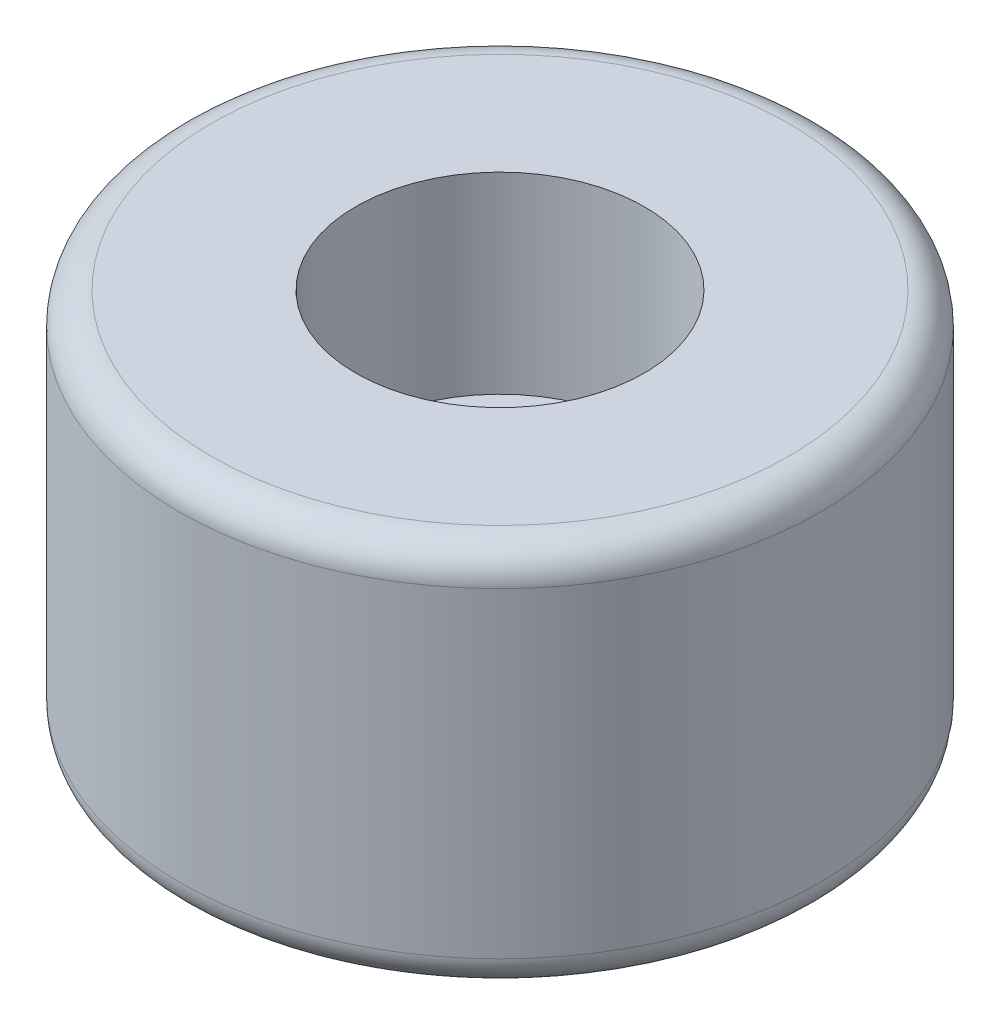
ISO-10303-21;
HEADER;
FILE_DESCRIPTION(('STEP AP214'),'2;1');
FILE_NAME('part.step','',(''),(''),'','','');
FILE_SCHEMA(('AUTOMOTIVE_DESIGN { 1 0 10303 214 1 1 1 1 }'));
ENDSEC;
DATA;
#1=APPLICATION_CONTEXT('core data for automotive mechanical design processes');
#2=APPLICATION_PROTOCOL_DEFINITION('international standard','automotive_design',2000,#1);
#3=PRODUCT_CONTEXT('',#1,'mechanical');
#4=PRODUCT('Part','Part','',(#3));
#5=PRODUCT_RELATED_PRODUCT_CATEGORY('part','',(#4));
#6=PRODUCT_DEFINITION_FORMATION('','',#4);
#7=PRODUCT_DEFINITION_CONTEXT('part definition',#1,'design');
#8=PRODUCT_DEFINITION('design','',#6,#7);
#9=PRODUCT_DEFINITION_SHAPE('','',#8);
#10=(LENGTH_UNIT() NAMED_UNIT(*) SI_UNIT(.MILLI.,.METRE.));
#11=(NAMED_UNIT(*) PLANE_ANGLE_UNIT() SI_UNIT($,.RADIAN.));
#12=(NAMED_UNIT(*) SI_UNIT($,.STERADIAN.) SOLID_ANGLE_UNIT());
#13=UNCERTAINTY_MEASURE_WITH_UNIT(LENGTH_MEASURE(1.E-05),#10,'distance_accuracy_value','');
#14=(GEOMETRIC_REPRESENTATION_CONTEXT(3) GLOBAL_UNCERTAINTY_ASSIGNED_CONTEXT((#13)) GLOBAL_UNIT_ASSIGNED_CONTEXT((#10,
#11,#12)) REPRESENTATION_CONTEXT('',''));
#15=CARTESIAN_POINT('',(0.,0.,0.));
#16=DIRECTION('',(0.,0.,1.));
#17=DIRECTION('',(1.,0.,0.));
#18=AXIS2_PLACEMENT_3D('',#15,#16,#17);
#19=CARTESIAN_POINT('',(0.,38.1,0.));
#20=DIRECTION('',(0.,-1.,0.));
#21=DIRECTION('',(0.,0.,-1.));
#22=AXIS2_PLACEMENT_3D('',#19,#20,#21);
#23=CYLINDRICAL_SURFACE('',#22,31.75);
#24=CARTESIAN_POINT('',(0.,3.175,0.));
#25=DIRECTION('',(0.,1.,0.));
#26=DIRECTION('',(0.,0.,1.));
#27=AXIS2_PLACEMENT_3D('',#24,#25,#26);
#28=CIRCLE('',#27,31.75);
#29=CARTESIAN_POINT('',(0.,3.175,-31.75));
#30=VERTEX_POINT('',#29);
#31=EDGE_CURVE('E332',#30,#30,#28,.T.);
#32=CARTESIAN_POINT('',(0.,34.925,0.));
#33=DIRECTION('',(0.,1.,0.));
#34=DIRECTION('',(0.,0.,1.));
#35=AXIS2_PLACEMENT_3D('',#32,#33,#34);
#36=CIRCLE('',#35,31.75);
#37=CARTESIAN_POINT('',(0.,34.925,-31.75));
#38=VERTEX_POINT('',#37);
#39=EDGE_CURVE('E327',#38,#38,#36,.F.);
#40=CARTESIAN_POINT('',(0.,3.175,-31.75));
#41=CARTESIAN_POINT('',(0.,3.50572916666666,-31.75));
#42=CARTESIAN_POINT('',(0.,3.83645833333333,-31.75));
#43=CARTESIAN_POINT('',(0.,4.49791666666666,-31.75));
#44=CARTESIAN_POINT('',(0.,4.82864583333333,-31.75));
#45=CARTESIAN_POINT('',(0.,5.49010416666667,-31.75));
#46=CARTESIAN_POINT('',(0.,5.82083333333333,-31.75));
#47=CARTESIAN_POINT('',(0.,6.48229166666666,-31.75));
#48=CARTESIAN_POINT('',(0.,6.81302083333333,-31.75));
#49=CARTESIAN_POINT('',(0.,7.47447916666666,-31.75));
#50=CARTESIAN_POINT('',(0.,7.80520833333333,-31.75));
#51=CARTESIAN_POINT('',(0.,8.46666666666666,-31.75));
#52=CARTESIAN_POINT('',(0.,8.79739583333333,-31.75));
#53=CARTESIAN_POINT('',(0.,9.45885416666666,-31.75));
#54=CARTESIAN_POINT('',(0.,9.78958333333333,-31.75));
#55=CARTESIAN_POINT('',(0.,10.4510416666667,-31.75));
#56=CARTESIAN_POINT('',(0.,10.7817708333333,-31.75));
#57=CARTESIAN_POINT('',(0.,11.4432291666667,-31.75));
#58=CARTESIAN_POINT('',(0.,11.7739583333333,-31.75));
#59=CARTESIAN_POINT('',(0.,12.4354166666667,-31.75));
#60=CARTESIAN_POINT('',(0.,12.7661458333333,-31.75));
#61=CARTESIAN_POINT('',(0.,13.4276041666667,-31.75));
#62=CARTESIAN_POINT('',(0.,13.7583333333333,-31.75));
#63=CARTESIAN_POINT('',(0.,14.4197916666667,-31.75));
#64=CARTESIAN_POINT('',(0.,14.7505208333333,-31.75));
#65=CARTESIAN_POINT('',(0.,15.4119791666667,-31.75));
#66=CARTESIAN_POINT('',(0.,15.7427083333333,-31.75));
#67=CARTESIAN_POINT('',(0.,16.4041666666667,-31.75));
#68=CARTESIAN_POINT('',(0.,16.7348958333333,-31.75));
#69=CARTESIAN_POINT('',(0.,17.3963541666667,-31.75));
#70=CARTESIAN_POINT('',(0.,17.7270833333333,-31.75));
#71=CARTESIAN_POINT('',(0.,18.3885416666667,-31.75));
#72=CARTESIAN_POINT('',(0.,18.7192708333333,-31.75));
#73=CARTESIAN_POINT('',(0.,19.3807291666667,-31.75));
#74=CARTESIAN_POINT('',(0.,19.7114583333333,-31.75));
#75=CARTESIAN_POINT('',(0.,20.3729166666667,-31.75));
#76=CARTESIAN_POINT('',(0.,20.7036458333333,-31.75));
#77=CARTESIAN_POINT('',(0.,21.3651041666667,-31.75));
#78=CARTESIAN_POINT('',(0.,21.6958333333333,-31.75));
#79=CARTESIAN_POINT('',(0.,22.3572916666667,-31.75));
#80=CARTESIAN_POINT('',(0.,22.6880208333333,-31.75));
#81=CARTESIAN_POINT('',(0.,23.3494791666667,-31.75));
#82=CARTESIAN_POINT('',(0.,23.6802083333333,-31.75));
#83=CARTESIAN_POINT('',(0.,24.3416666666667,-31.75));
#84=CARTESIAN_POINT('',(0.,24.6723958333333,-31.75));
#85=CARTESIAN_POINT('',(0.,25.3338541666667,-31.75));
#86=CARTESIAN_POINT('',(0.,25.6645833333333,-31.75));
#87=CARTESIAN_POINT('',(0.,26.3260416666667,-31.75));
#88=CARTESIAN_POINT('',(0.,26.6567708333333,-31.75));
#89=CARTESIAN_POINT('',(0.,27.3182291666667,-31.75));
#90=CARTESIAN_POINT('',(0.,27.6489583333333,-31.75));
#91=CARTESIAN_POINT('',(0.,28.3104166666667,-31.75));
#92=CARTESIAN_POINT('',(0.,28.6411458333333,-31.75));
#93=CARTESIAN_POINT('',(0.,29.3026041666667,-31.75));
#94=CARTESIAN_POINT('',(0.,29.6333333333333,-31.75));
#95=CARTESIAN_POINT('',(0.,30.2947916666667,-31.75));
#96=CARTESIAN_POINT('',(0.,30.6255208333333,-31.75));
#97=CARTESIAN_POINT('',(0.,31.2869791666667,-31.75));
#98=CARTESIAN_POINT('',(0.,31.6177083333333,-31.75));
#99=CARTESIAN_POINT('',(0.,32.2791666666667,-31.75));
#100=CARTESIAN_POINT('',(0.,32.6098958333333,-31.75));
#101=CARTESIAN_POINT('',(0.,33.2713541666667,-31.75));
#102=CARTESIAN_POINT('',(0.,33.6020833333333,-31.75));
#103=CARTESIAN_POINT('',(0.,34.2635416666667,-31.75));
#104=CARTESIAN_POINT('',(0.,34.5942708333333,-31.75));
#105=CARTESIAN_POINT('',(0.,34.925,-31.75));
#106=B_SPLINE_CURVE_WITH_KNOTS('',3,(#40,#41,#42,#43,#44,#45,#46,#47,#48,#49,#50,#51,#52,#53,
#54,#55,#56,#57,#58,#59,#60,#61,#62,#63,#64,#65,#66,#67,#68,#69,#70,#71,#72,#73,#74,#75,#76,#77,
#78,#79,#80,#81,#82,#83,#84,#85,#86,#87,#88,#89,#90,#91,#92,#93,#94,#95,#96,#97,#98,#99,#100,
#101,#102,#103,#104,#105),.UNSPECIFIED.,.F.,.F.,(4,2,2,2,2,2,2,2,2,2,2,2,2,2,2,2,2,2,2,2,2,2,2,
2,2,2,2,2,2,2,2,2,4),(0.,0.992187499999998,1.984375,2.9765625,3.96875,4.9609375,5.953125,
6.9453125,7.9375,8.9296875,9.921875,10.9140625,11.90625,12.8984375,13.890625,14.8828125,15.875,
16.8671875,17.859375,18.8515625,19.84375,20.8359375,21.828125,22.8203125,23.8125,24.8046875,
25.796875,26.7890625,27.78125,28.7734375,29.765625,30.7578125,31.75),.UNSPECIFIED.);
#107=EDGE_CURVE('BSEAM37',#30,#38,#106,.T.);
#108=ORIENTED_EDGE('',*,*,#31,.T.);
#109=ORIENTED_EDGE('',*,*,#39,.T.);
#110=ORIENTED_EDGE('',*,*,#107,.T.);
#111=ORIENTED_EDGE('',*,*,#107,.F.);
#112=EDGE_LOOP('',(#108,#110,#109,#111));
#113=FACE_BOUND('',#112,.T.);
#114=ADVANCED_FACE('F37',(#113),#23,.T.);
#115=CARTESIAN_POINT('',(0.,38.1,0.));
#116=DIRECTION('',(0.,1.,0.));
#117=DIRECTION('',(0.,0.,1.));
#118=AXIS2_PLACEMENT_3D('',#115,#116,#117);
#119=PLANE('',#118);
#120=CARTESIAN_POINT('',(0.,38.1,0.));
#121=DIRECTION('',(0.,1.,0.));
#122=DIRECTION('',(0.,0.,1.));
#123=AXIS2_PLACEMENT_3D('',#120,#121,#122);
#124=CIRCLE('',#123,14.2875);
#125=CARTESIAN_POINT('',(0.,38.1,14.2875));
#126=VERTEX_POINT('',#125);
#127=EDGE_CURVE('E323',#126,#126,#124,.T.);
#128=ORIENTED_EDGE('',*,*,#127,.F.);
#129=EDGE_LOOP('',(#128));
#130=FACE_BOUND('',#129,.T.);
#131=CARTESIAN_POINT('',(0.,38.1,0.));
#132=DIRECTION('',(0.,1.,0.));
#133=DIRECTION('',(0.,0.,1.));
#134=AXIS2_PLACEMENT_3D('',#131,#132,#133);
#135=CIRCLE('',#134,28.575);
#136=CARTESIAN_POINT('',(0.,38.1,28.575));
#137=VERTEX_POINT('',#136);
#138=EDGE_CURVE('E11',#137,#137,#135,.T.);
#139=ORIENTED_EDGE('',*,*,#138,.T.);
#140=EDGE_LOOP('',(#139));
#141=FACE_BOUND('',#140,.T.);
#142=ADVANCED_FACE('F349',(#130,#141),#119,.T.);
#143=CARTESIAN_POINT('',(0.,0.,0.));
#144=DIRECTION('',(0.,1.,0.));
#145=DIRECTION('',(0.,0.,1.));
#146=AXIS2_PLACEMENT_3D('',#143,#144,#145);
#147=PLANE('',#146);
#148=CARTESIAN_POINT('',(0.,0.,0.));
#149=DIRECTION('',(0.,-1.,0.));
#150=DIRECTION('',(0.,0.,-1.));
#151=AXIS2_PLACEMENT_3D('',#148,#149,#150);
#152=CIRCLE('',#151,14.2875);
#153=CARTESIAN_POINT('',(0.,0.,-14.2875));
#154=VERTEX_POINT('',#153);
#155=EDGE_CURVE('E149',#154,#154,#152,.T.);
#156=ORIENTED_EDGE('',*,*,#155,.F.);
#157=EDGE_LOOP('',(#156));
#158=FACE_BOUND('',#157,.T.);
#159=CARTESIAN_POINT('',(0.,0.,0.));
#160=DIRECTION('',(0.,1.,0.));
#161=DIRECTION('',(0.,0.,1.));
#162=AXIS2_PLACEMENT_3D('',#159,#160,#161);
#163=CIRCLE('',#162,28.575);
#164=CARTESIAN_POINT('',(0.,0.,28.575));
#165=VERTEX_POINT('',#164);
#166=EDGE_CURVE('E47',#165,#165,#163,.F.);
#167=ORIENTED_EDGE('',*,*,#166,.T.);
#168=EDGE_LOOP('',(#167));
#169=FACE_BOUND('',#168,.T.);
#170=ADVANCED_FACE('F355',(#158,#169),#147,.F.);
#171=CARTESIAN_POINT('',(0.,3.175,0.));
#172=DIRECTION('',(0.,1.,0.));
#173=DIRECTION('',(0.,0.,1.));
#174=AXIS2_PLACEMENT_3D('',#171,#172,#173);
#175=TOROIDAL_SURFACE('',#174,28.575,3.175);
#176=ORIENTED_EDGE('',*,*,#166,.F.);
#177=EDGE_LOOP('',(#176));
#178=FACE_BOUND('',#177,.T.);
#179=ORIENTED_EDGE('',*,*,#31,.F.);
#180=EDGE_LOOP('',(#179));
#181=FACE_BOUND('',#180,.T.);
#182=ADVANCED_FACE('F361',(#178,#181),#175,.T.);
#183=CARTESIAN_POINT('',(0.,34.925,0.));
#184=DIRECTION('',(0.,1.,0.));
#185=DIRECTION('',(0.,0.,1.));
#186=AXIS2_PLACEMENT_3D('',#183,#184,#185);
#187=TOROIDAL_SURFACE('',#186,28.575,3.175);
#188=ORIENTED_EDGE('',*,*,#39,.F.);
#189=EDGE_LOOP('',(#188));
#190=FACE_BOUND('',#189,.T.);
#191=ORIENTED_EDGE('',*,*,#138,.F.);
#192=EDGE_LOOP('',(#191));
#193=FACE_BOUND('',#192,.T.);
#194=ADVANCED_FACE('F363',(#190,#193),#187,.T.);
#195=CARTESIAN_POINT('',(0.,19.05,0.));
#196=DIRECTION('',(0.,1.,0.));
#197=DIRECTION('',(0.,0.,1.));
#198=AXIS2_PLACEMENT_3D('',#195,#196,#197);
#199=CYLINDRICAL_SURFACE('',#198,14.2875);
#200=CARTESIAN_POINT('',(0.,19.05,0.));
#201=DIRECTION('',(0.,1.,0.));
#202=DIRECTION('',(0.,0.,1.));
#203=AXIS2_PLACEMENT_3D('',#200,#201,#202);
#204=CIRCLE('',#203,14.2875);
#205=CARTESIAN_POINT('',(0.,19.05,14.2875));
#206=VERTEX_POINT('',#205);
#207=EDGE_CURVE('E324',#206,#206,#204,.T.);
#208=CARTESIAN_POINT('',(0.,19.05,14.2875));
#209=CARTESIAN_POINT('',(0.,19.2484375,14.2875));
#210=CARTESIAN_POINT('',(0.,19.446875,14.2875));
#211=CARTESIAN_POINT('',(0.,19.84375,14.2875));
#212=CARTESIAN_POINT('',(0.,20.0421875,14.2875));
#213=CARTESIAN_POINT('',(0.,20.4390625,14.2875));
#214=CARTESIAN_POINT('',(0.,20.6375,14.2875));
#215=CARTESIAN_POINT('',(0.,21.034375,14.2875));
#216=CARTESIAN_POINT('',(0.,21.2328125,14.2875));
#217=CARTESIAN_POINT('',(0.,21.6296875,14.2875));
#218=CARTESIAN_POINT('',(0.,21.828125,14.2875));
#219=CARTESIAN_POINT('',(0.,22.225,14.2875));
#220=CARTESIAN_POINT('',(0.,22.4234375,14.2875));
#221=CARTESIAN_POINT('',(0.,22.8203125,14.2875));
#222=CARTESIAN_POINT('',(0.,23.01875,14.2875));
#223=CARTESIAN_POINT('',(0.,23.415625,14.2875));
#224=CARTESIAN_POINT('',(0.,23.6140625,14.2875));
#225=CARTESIAN_POINT('',(0.,24.0109375,14.2875));
#226=CARTESIAN_POINT('',(0.,24.209375,14.2875));
#227=CARTESIAN_POINT('',(0.,24.60625,14.2875));
#228=CARTESIAN_POINT('',(0.,24.8046875,14.2875));
#229=CARTESIAN_POINT('',(0.,25.2015625,14.2875));
#230=CARTESIAN_POINT('',(0.,25.4,14.2875));
#231=CARTESIAN_POINT('',(0.,25.796875,14.2875));
#232=CARTESIAN_POINT('',(0.,25.9953125,14.2875));
#233=CARTESIAN_POINT('',(0.,26.3921875,14.2875));
#234=CARTESIAN_POINT('',(0.,26.590625,14.2875));
#235=CARTESIAN_POINT('',(0.,26.9875,14.2875));
#236=CARTESIAN_POINT('',(0.,27.1859375,14.2875));
#237=CARTESIAN_POINT('',(0.,27.5828125,14.2875));
#238=CARTESIAN_POINT('',(0.,27.78125,14.2875));
#239=CARTESIAN_POINT('',(0.,28.178125,14.2875));
#240=CARTESIAN_POINT('',(0.,28.3765625,14.2875));
#241=CARTESIAN_POINT('',(0.,28.7734375,14.2875));
#242=CARTESIAN_POINT('',(0.,28.971875,14.2875));
#243=CARTESIAN_POINT('',(0.,29.36875,14.2875));
#244=CARTESIAN_POINT('',(0.,29.5671875,14.2875));
#245=CARTESIAN_POINT('',(0.,29.9640625,14.2875));
#246=CARTESIAN_POINT('',(0.,30.1625,14.2875));
#247=CARTESIAN_POINT('',(0.,30.559375,14.2875));
#248=CARTESIAN_POINT('',(0.,30.7578125,14.2875));
#249=CARTESIAN_POINT('',(0.,31.1546875,14.2875));
#250=CARTESIAN_POINT('',(0.,31.353125,14.2875));
#251=CARTESIAN_POINT('',(0.,31.75,14.2875));
#252=CARTESIAN_POINT('',(0.,31.9484375,14.2875));
#253=CARTESIAN_POINT('',(0.,32.3453125,14.2875));
#254=CARTESIAN_POINT('',(0.,32.54375,14.2875));
#255=CARTESIAN_POINT('',(0.,32.940625,14.2875));
#256=CARTESIAN_POINT('',(0.,33.1390625,14.2875));
#257=CARTESIAN_POINT('',(0.,33.5359375,14.2875));
#258=CARTESIAN_POINT('',(0.,33.734375,14.2875));
#259=CARTESIAN_POINT('',(0.,34.13125,14.2875));
#260=CARTESIAN_POINT('',(0.,34.3296875,14.2875));
#261=CARTESIAN_POINT('',(0.,34.7265625,14.2875));
#262=CARTESIAN_POINT('',(0.,34.925,14.2875));
#263=CARTESIAN_POINT('',(0.,35.321875,14.2875));
#264=CARTESIAN_POINT('',(0.,35.5203125,14.2875));
#265=CARTESIAN_POINT('',(0.,35.9171875,14.2875));
#266=CARTESIAN_POINT('',(0.,36.115625,14.2875));
#267=CARTESIAN_POINT('',(0.,36.5125,14.2875));
#268=CARTESIAN_POINT('',(0.,36.7109375,14.2875));
#269=CARTESIAN_POINT('',(0.,37.1078125,14.2875));
#270=CARTESIAN_POINT('',(0.,37.30625,14.2875));
#271=CARTESIAN_POINT('',(0.,37.703125,14.2875));
#272=CARTESIAN_POINT('',(0.,37.9015625,14.2875));
#273=CARTESIAN_POINT('',(0.,38.1,14.2875));
#274=B_SPLINE_CURVE_WITH_KNOTS('',3,(#208,#209,#210,#211,#212,#213,#214,#215,#216,#217,#218,
#219,#220,#221,#222,#223,#224,#225,#226,#227,#228,#229,#230,#231,#232,#233,#234,#235,#236,#237,
#238,#239,#240,#241,#242,#243,#244,#245,#246,#247,#248,#249,#250,#251,#252,#253,#254,#255,#256,
#257,#258,#259,#260,#261,#262,#263,#264,#265,#266,#267,#268,#269,#270,#271,#272,#273),
.UNSPECIFIED.,.F.,.F.,(4,2,2,2,2,2,2,2,2,2,2,2,2,2,2,2,2,2,2,2,2,2,2,2,2,2,2,2,2,2,2,2,4),(0.,
0.595312499999997,1.190625,1.7859375,2.38125,2.9765625,3.571875,4.1671875,4.7625,5.3578125,
5.953125,6.5484375,7.14375,7.7390625,8.334375,8.9296875,9.525,10.1203125,10.715625,11.3109375,
11.90625,12.5015625,13.096875,13.6921875,14.2875,14.8828125,15.478125,16.0734375,16.66875,
17.2640625,17.859375,18.4546875,19.05),.UNSPECIFIED.);
#275=EDGE_CURVE('BSEAM366',#206,#126,#274,.T.);
#276=ORIENTED_EDGE('',*,*,#207,.F.);
#277=ORIENTED_EDGE('',*,*,#127,.T.);
#278=ORIENTED_EDGE('',*,*,#275,.T.);
#279=ORIENTED_EDGE('',*,*,#275,.F.);
#280=EDGE_LOOP('',(#276,#278,#277,#279));
#281=FACE_BOUND('',#280,.T.);
#282=ADVANCED_FACE('F366',(#281),#199,.F.);
#283=CARTESIAN_POINT('',(0.,19.05,0.));
#284=DIRECTION('',(0.,1.,0.));
#285=DIRECTION('',(0.,0.,1.));
#286=AXIS2_PLACEMENT_3D('',#283,#284,#285);
#287=PLANE('',#286);
#288=CARTESIAN_POINT('',(0.,19.05,-7.9375));
#289=DIRECTION('',(0.,1.,0.));
#290=DIRECTION('',(0.,0.,1.));
#291=AXIS2_PLACEMENT_3D('',#288,#289,#290);
#292=CIRCLE('',#291,1.5875);
#293=CARTESIAN_POINT('',(0.,19.05,-6.35));
#294=VERTEX_POINT('',#293);
#295=EDGE_CURVE('E254',#294,#294,#292,.T.);
#296=ORIENTED_EDGE('',*,*,#295,.F.);
#297=EDGE_LOOP('',(#296));
#298=FACE_BOUND('',#297,.T.);
#299=CARTESIAN_POINT('',(0.,19.05,7.9375));
#300=DIRECTION('',(0.,1.,0.));
#301=DIRECTION('',(0.,0.,1.));
#302=AXIS2_PLACEMENT_3D('',#299,#300,#301);
#303=CIRCLE('',#302,1.5875);
#304=CARTESIAN_POINT('',(0.,19.05,9.525));
#305=VERTEX_POINT('',#304);
#306=EDGE_CURVE('E414',#305,#305,#303,.T.);
#307=ORIENTED_EDGE('',*,*,#306,.F.);
#308=EDGE_LOOP('',(#307));
#309=FACE_BOUND('',#308,.T.);
#310=CARTESIAN_POINT('',(0.,19.05,0.));
#311=DIRECTION('',(0.,1.,0.));
#312=DIRECTION('',(0.,0.,1.));
#313=AXIS2_PLACEMENT_3D('',#310,#311,#312);
#314=CIRCLE('',#313,4.7625);
#315=CARTESIAN_POINT('',(0.,19.05,4.7625));
#316=VERTEX_POINT('',#315);
#317=EDGE_CURVE('E319',#316,#316,#314,.T.);
#318=ORIENTED_EDGE('',*,*,#317,.F.);
#319=EDGE_LOOP('',(#318));
#320=FACE_BOUND('',#319,.T.);
#321=ORIENTED_EDGE('',*,*,#207,.T.);
#322=EDGE_LOOP('',(#321));
#323=FACE_BOUND('',#322,.T.);
#324=ADVANCED_FACE('F371',(#298,#309,#320,#323),#287,.T.);
#325=CARTESIAN_POINT('',(0.,15.875,0.));
#326=DIRECTION('',(0.,1.,0.));
#327=DIRECTION('',(0.,0.,1.));
#328=AXIS2_PLACEMENT_3D('',#325,#326,#327);
#329=CYLINDRICAL_SURFACE('',#328,4.7625);
#330=ORIENTED_EDGE('',*,*,#317,.T.);
#331=EDGE_LOOP('',(#330));
#332=FACE_BOUND('',#331,.T.);
#333=CARTESIAN_POINT('',(0.,6.35,0.));
#334=DIRECTION('',(0.,-1.,0.));
#335=DIRECTION('',(0.,0.,-1.));
#336=AXIS2_PLACEMENT_3D('',#333,#334,#335);
#337=CIRCLE('',#336,4.7625);
#338=CARTESIAN_POINT('',(0.,6.35,-4.7625));
#339=VERTEX_POINT('',#338);
#340=EDGE_CURVE('E143',#339,#339,#337,.F.);
#341=ORIENTED_EDGE('',*,*,#340,.F.);
#342=EDGE_LOOP('',(#341));
#343=FACE_BOUND('',#342,.T.);
#344=ADVANCED_FACE('F381',(#332,#343),#329,.F.);
#345=CARTESIAN_POINT('',(0.,15.875,0.));
#346=DIRECTION('',(0.,-1.,0.));
#347=DIRECTION('',(0.,0.,-1.));
#348=AXIS2_PLACEMENT_3D('',#345,#346,#347);
#349=PLANE('',#348);
#350=CARTESIAN_POINT('',(0.,15.875,0.));
#351=DIRECTION('',(0.,-1.,0.));
#352=DIRECTION('',(0.,0.,-1.));
#353=AXIS2_PLACEMENT_3D('',#350,#351,#352);
#354=CIRCLE('',#353,6.84918409767097);
#355=CARTESIAN_POINT('',(-3.16620405283585,15.875,6.07342363906839));
#356=VERTEX_POINT('',#355);
#357=CARTESIAN_POINT('',(-6.68309582791384,15.875,1.49918409767097));
#358=VERTEX_POINT('',#357);
#359=EDGE_CURVE('E252',#356,#358,#354,.T.);
#360=ORIENTED_EDGE('',*,*,#359,.F.);
#361=CARTESIAN_POINT('',(0.,15.875,7.9375));
#362=DIRECTION('',(0.,-1.,0.));
#363=DIRECTION('',(0.,0.,-1.));
#364=AXIS2_PLACEMENT_3D('',#361,#362,#363);
#365=CIRCLE('',#364,3.67418409767097);
#366=CARTESIAN_POINT('',(3.16620405283586,15.875,6.07342363906838));
#367=VERTEX_POINT('',#366);
#368=EDGE_CURVE('E147',#367,#356,#365,.T.);
#369=ORIENTED_EDGE('',*,*,#368,.F.);
#370=CARTESIAN_POINT('',(0.,15.875,0.));
#371=DIRECTION('',(0.,-1.,0.));
#372=DIRECTION('',(0.,0.,-1.));
#373=AXIS2_PLACEMENT_3D('',#370,#371,#372);
#374=CIRCLE('',#373,6.84918409767097);
#375=CARTESIAN_POINT('',(6.68309582791384,15.875,1.49918409767097));
#376=VERTEX_POINT('',#375);
#377=EDGE_CURVE('E255',#376,#367,#374,.T.);
#378=ORIENTED_EDGE('',*,*,#377,.F.);
#379=DIRECTION('',(1.,0.,0.));
#380=VECTOR('',#379,1.);
#381=CARTESIAN_POINT('',(0.,15.875,1.49918409767095));
#382=LINE('',#381,#380);
#383=CARTESIAN_POINT('',(9.525,15.875,1.49918409767097));
#384=VERTEX_POINT('',#383);
#385=EDGE_CURVE('E41',#376,#384,#382,.T.);
#386=ORIENTED_EDGE('',*,*,#385,.T.);
#387=CARTESIAN_POINT('',(9.525,15.875,0.));
#388=DIRECTION('',(0.,-1.,0.));
#389=DIRECTION('',(0.,0.,-1.));
#390=AXIS2_PLACEMENT_3D('',#387,#388,#389);
#391=CIRCLE('',#390,1.49918409767097);
#392=CARTESIAN_POINT('',(9.525,15.875,-1.49918409767097));
#393=VERTEX_POINT('',#392);
#394=EDGE_CURVE('E230',#384,#393,#391,.F.);
#395=ORIENTED_EDGE('',*,*,#394,.T.);
#396=DIRECTION('',(-1.,0.,0.));
#397=VECTOR('',#396,1.);
#398=CARTESIAN_POINT('',(0.,15.875,-1.49918409767098));
#399=LINE('',#398,#397);
#400=CARTESIAN_POINT('',(6.68309582791384,15.875,-1.49918409767097));
#401=VERTEX_POINT('',#400);
#402=EDGE_CURVE('E233',#401,#393,#399,.F.);
#403=ORIENTED_EDGE('',*,*,#402,.F.);
#404=CARTESIAN_POINT('',(0.,15.875,0.));
#405=DIRECTION('',(0.,-1.,0.));
#406=DIRECTION('',(0.,0.,-1.));
#407=AXIS2_PLACEMENT_3D('',#404,#405,#406);
#408=CIRCLE('',#407,6.84918409767097);
#409=CARTESIAN_POINT('',(3.16620405283586,15.875,-6.07342363906838));
#410=VERTEX_POINT('',#409);
#411=EDGE_CURVE('E236',#410,#401,#408,.T.);
#412=ORIENTED_EDGE('',*,*,#411,.F.);
#413=CARTESIAN_POINT('',(0.,15.875,-7.9375));
#414=DIRECTION('',(0.,-1.,0.));
#415=DIRECTION('',(0.,0.,-1.));
#416=AXIS2_PLACEMENT_3D('',#413,#414,#415);
#417=CIRCLE('',#416,3.67418409767097);
#418=CARTESIAN_POINT('',(-3.16620405283585,15.875,-6.07342363906839));
#419=VERTEX_POINT('',#418);
#420=EDGE_CURVE('E238',#410,#419,#417,.F.);
#421=ORIENTED_EDGE('',*,*,#420,.T.);
#422=CARTESIAN_POINT('',(0.,15.875,0.));
#423=DIRECTION('',(0.,-1.,0.));
#424=DIRECTION('',(0.,0.,-1.));
#425=AXIS2_PLACEMENT_3D('',#422,#423,#424);
#426=CIRCLE('',#425,6.84918409767097);
#427=CARTESIAN_POINT('',(-6.68309582791384,15.875,-1.49918409767097));
#428=VERTEX_POINT('',#427);
#429=EDGE_CURVE('E241',#428,#419,#426,.T.);
#430=ORIENTED_EDGE('',*,*,#429,.F.);
#431=DIRECTION('',(-1.,0.,0.));
#432=VECTOR('',#431,1.);
#433=CARTESIAN_POINT('',(0.,15.875,-1.49918409767097));
#434=LINE('',#433,#432);
#435=CARTESIAN_POINT('',(-9.525,15.875,-1.49918409767097));
#436=VERTEX_POINT('',#435);
#437=EDGE_CURVE('E244',#428,#436,#434,.T.);
#438=ORIENTED_EDGE('',*,*,#437,.T.);
#439=CARTESIAN_POINT('',(-9.525,15.875,0.));
#440=DIRECTION('',(0.,-1.,0.));
#441=DIRECTION('',(0.,0.,-1.));
#442=AXIS2_PLACEMENT_3D('',#439,#440,#441);
#443=CIRCLE('',#442,1.49918409767097);
#444=CARTESIAN_POINT('',(-9.525,15.875,1.49918409767097));
#445=VERTEX_POINT('',#444);
#446=EDGE_CURVE('E247',#445,#436,#443,.T.);
#447=ORIENTED_EDGE('',*,*,#446,.F.);
#448=DIRECTION('',(1.,0.,0.));
#449=VECTOR('',#448,1.);
#450=CARTESIAN_POINT('',(0.,15.875,1.49918409767097));
#451=LINE('',#450,#449);
#452=EDGE_CURVE('E250',#358,#445,#451,.F.);
#453=ORIENTED_EDGE('',*,*,#452,.F.);
#454=EDGE_LOOP('',(#360,#369,#378,#386,#395,#403,#412,#421,#430,#438,#447,#453));
#455=FACE_BOUND('',#454,.T.);
#456=CARTESIAN_POINT('',(0.,15.875,0.));
#457=DIRECTION('',(0.,-1.,0.));
#458=DIRECTION('',(0.,0.,-1.));
#459=AXIS2_PLACEMENT_3D('',#456,#457,#458);
#460=CIRCLE('',#459,14.2875);
#461=CARTESIAN_POINT('',(0.,15.875,-14.2875));
#462=VERTEX_POINT('',#461);
#463=EDGE_CURVE('E152',#462,#462,#460,.T.);
#464=ORIENTED_EDGE('',*,*,#463,.T.);
#465=EDGE_LOOP('',(#464));
#466=FACE_BOUND('',#465,.T.);
#467=ADVANCED_FACE('F261',(#455,#466),#349,.T.);
#468=CARTESIAN_POINT('',(0.,15.875,0.));
#469=DIRECTION('',(0.,-1.,0.));
#470=DIRECTION('',(0.,0.,-1.));
#471=AXIS2_PLACEMENT_3D('',#468,#469,#470);
#472=CYLINDRICAL_SURFACE('',#471,14.2875);
#473=ORIENTED_EDGE('',*,*,#463,.F.);
#474=EDGE_LOOP('',(#473));
#475=FACE_BOUND('',#474,.T.);
#476=ORIENTED_EDGE('',*,*,#155,.T.);
#477=EDGE_LOOP('',(#476));
#478=FACE_BOUND('',#477,.T.);
#479=ADVANCED_FACE('F390',(#475,#478),#472,.F.);
#480=CARTESIAN_POINT('',(0.,6.35,7.9375));
#481=DIRECTION('',(0.,1.,0.));
#482=DIRECTION('',(0.,0.,-1.));
#483=AXIS2_PLACEMENT_3D('',#480,#481,#482);
#484=CONICAL_SURFACE('',#483,3.175,0.05235987755983);
#485=ORIENTED_EDGE('',*,*,#368,.T.);
#486=CARTESIAN_POINT('',(-2.41279110937934,6.35,5.87375));
#487=CARTESIAN_POINT('',(-2.45630614769639,6.8508668203857,5.88424972716326));
#488=CARTESIAN_POINT('',(-2.49902492405931,7.35180201506076,5.89475088761746));
#489=CARTESIAN_POINT('',(-2.58306731980624,8.35378853523542,5.91575564295514));
#490=CARTESIAN_POINT('',(-2.62439094176189,8.85483986051925,5.92625923783409));
#491=CARTESIAN_POINT('',(-2.74656427281408,10.3581264862478,5.95777280326331));
#492=CARTESIAN_POINT('',(-2.82561759929753,11.3605078211522,5.97878583518848));
#493=CARTESIAN_POINT('',(-2.94787891433892,12.9482687697589,6.01207024533795));
#494=CARTESIAN_POINT('',(-2.99231087555687,13.5335549742771,6.02433966542566));
#495=CARTESIAN_POINT('',(-3.0800580390078,14.7042156335098,6.04888035559971));
#496=CARTESIAN_POINT('',(-3.12337323263874,15.2895900888691,6.06115162569956));
#497=CARTESIAN_POINT('',(-3.16620405283698,15.8749999999999,6.07342363906807));
#498=B_SPLINE_CURVE_WITH_KNOTS('',3,(#486,#487,#488,#489,#490,#491,#492,#493,#494,#495,#496,
#497),.UNSPECIFIED.,.F.,.F.,(4,2,2,2,2,4),(0.,1.5085876976076,3.01717261433928,6.03430213722948,
7.79559693124262,9.55690528782632),.UNSPECIFIED.);
#499=CARTESIAN_POINT('',(-2.41279110937934,6.35,5.87375));
#500=VERTEX_POINT('',#499);
#501=EDGE_CURVE('E126',#500,#356,#498,.T.);
#502=ORIENTED_EDGE('',*,*,#501,.F.);
#503=CARTESIAN_POINT('',(0.,6.35,7.9375));
#504=DIRECTION('',(0.,-1.,0.));
#505=DIRECTION('',(0.,0.,-1.));
#506=AXIS2_PLACEMENT_3D('',#503,#504,#505);
#507=CIRCLE('',#506,3.175);
#508=CARTESIAN_POINT('',(2.41279110937935,6.35,5.87374999999999));
#509=VERTEX_POINT('',#508);
#510=EDGE_CURVE('E133',#509,#500,#507,.T.);
#511=ORIENTED_EDGE('',*,*,#510,.F.);
#512=CARTESIAN_POINT('',(2.41279110937935,6.35,5.87374999999999));
#513=CARTESIAN_POINT('',(2.4563061476964,6.8508668203857,5.88424972716325));
#514=CARTESIAN_POINT('',(2.49902492405932,7.35180201506076,5.89475088761746));
#515=CARTESIAN_POINT('',(2.58306731980625,8.35378853523542,5.91575564295513));
#516=CARTESIAN_POINT('',(2.6243909417619,8.85483986051924,5.92625923783408));
#517=CARTESIAN_POINT('',(2.74656427281409,10.3581264862478,5.95777280326331));
#518=CARTESIAN_POINT('',(2.82561759929754,11.3605078211522,5.97878583518848));
#519=CARTESIAN_POINT('',(2.94787891433893,12.9482687697589,6.01207024533794));
#520=CARTESIAN_POINT('',(2.99231087555687,13.5335549742771,6.02433966542566));
#521=CARTESIAN_POINT('',(3.08005803900781,14.7042156335098,6.0488803555997));
#522=CARTESIAN_POINT('',(3.12337323263875,15.2895900888691,6.06115162569955));
#523=CARTESIAN_POINT('',(3.16620405283699,15.8749999999999,6.07342363906806));
#524=B_SPLINE_CURVE_WITH_KNOTS('',3,(#512,#513,#514,#515,#516,#517,#518,#519,#520,#521,#522,
#523),.UNSPECIFIED.,.F.,.F.,(4,2,2,2,2,4),(0.,1.5085876976076,3.01717261433928,6.03430213722948,
7.79559693124262,9.55690528782632),.UNSPECIFIED.);
#525=EDGE_CURVE('E162',#509,#367,#524,.T.);
#526=ORIENTED_EDGE('',*,*,#525,.T.);
#527=EDGE_LOOP('',(#485,#502,#511,#526));
#528=FACE_BOUND('',#527,.T.);
#529=ADVANCED_FACE('F145',(#528),#484,.T.);
#530=CARTESIAN_POINT('',(0.,6.35,0.));
#531=DIRECTION('',(0.,1.,0.));
#532=DIRECTION('',(0.,0.,-1.));
#533=AXIS2_PLACEMENT_3D('',#530,#531,#532);
#534=CONICAL_SURFACE('',#533,6.35,0.05235987755983);
#535=ORIENTED_EDGE('',*,*,#359,.T.);
#536=CARTESIAN_POINT('',(-6.27076550350912,6.35,1.));
#537=CARTESIAN_POINT('',(-6.30625346934864,7.14370101222677,1.04159610746551));
#538=CARTESIAN_POINT('',(-6.34144156215967,7.93741537440604,1.08319291457238));
#539=CARTESIAN_POINT('',(-6.41124551993895,9.5248688203016,1.16638782438698));
#540=CARTESIAN_POINT('',(-6.44586138517704,10.3186079040061,1.20798592709408));
#541=CARTESIAN_POINT('',(-6.51454843783208,11.9061095259307,1.29118336170738));
#542=CARTESIAN_POINT('',(-6.54861962527459,12.6998720641499,1.33278269361352));
#543=CARTESIAN_POINT('',(-6.61624178302234,14.2874196163626,1.41598253533121));
#544=CARTESIAN_POINT('',(-6.64979275308228,15.0812046303666,1.45758304514332));
#545=CARTESIAN_POINT('',(-6.68309582791384,15.875,1.49918409767097));
#546=B_SPLINE_CURVE_WITH_KNOTS('',3,(#536,#537,#538,#539,#540,#541,#542,#543,#544,#545),
.UNSPECIFIED.,.F.,.F.,(4,2,2,2,4),(0.,2.38674630858661,4.77349149166319,7.16023656281573,
9.5469827593859),.UNSPECIFIED.);
#547=CARTESIAN_POINT('',(-6.27076550350912,6.35,1.));
#548=VERTEX_POINT('',#547);
#549=EDGE_CURVE('E129',#548,#358,#546,.T.);
#550=ORIENTED_EDGE('',*,*,#549,.F.);
#551=CARTESIAN_POINT('',(0.,6.35,0.));
#552=DIRECTION('',(0.,-1.,0.));
#553=DIRECTION('',(0.,0.,-1.));
#554=AXIS2_PLACEMENT_3D('',#551,#552,#553);
#555=CIRCLE('',#554,6.35);
#556=EDGE_CURVE('E122',#500,#548,#555,.T.);
#557=ORIENTED_EDGE('',*,*,#556,.F.);
#558=ORIENTED_EDGE('',*,*,#501,.T.);
#559=EDGE_LOOP('',(#535,#550,#557,#558));
#560=FACE_BOUND('',#559,.T.);
#561=ADVANCED_FACE('F124',(#560),#534,.T.);
#562=CARTESIAN_POINT('',(0.,6.35,1.));
#563=DIRECTION('',(0.,-0.0523359562429439,0.998629534754574));
#564=DIRECTION('',(0.,-0.998629534754574,-0.052335956242944));
#565=AXIS2_PLACEMENT_3D('',#562,#563,#564);
#566=PLANE('',#565);
#567=ORIENTED_EDGE('',*,*,#452,.T.);
#568=DIRECTION('',(0.,0.998629534754574,0.0523359562429439));
#569=VECTOR('',#568,1.);
#570=CARTESIAN_POINT('',(-9.525,6.35,1.));
#571=LINE('',#570,#569);
#572=CARTESIAN_POINT('',(-9.525,6.35,1.));
#573=VERTEX_POINT('',#572);
#574=EDGE_CURVE('E154',#573,#445,#571,.T.);
#575=ORIENTED_EDGE('',*,*,#574,.F.);
#576=DIRECTION('',(-1.,0.,0.));
#577=VECTOR('',#576,1.);
#578=CARTESIAN_POINT('',(0.,6.35,1.));
#579=LINE('',#578,#577);
#580=EDGE_CURVE('E132',#548,#573,#579,.T.);
#581=ORIENTED_EDGE('',*,*,#580,.F.);
#582=ORIENTED_EDGE('',*,*,#549,.T.);
#583=EDGE_LOOP('',(#567,#575,#581,#582));
#584=FACE_BOUND('',#583,.T.);
#585=ADVANCED_FACE('F177',(#584),#566,.T.);
#586=CARTESIAN_POINT('',(-9.525,6.35,0.));
#587=DIRECTION('',(0.,1.,0.));
#588=DIRECTION('',(0.,0.,-1.));
#589=AXIS2_PLACEMENT_3D('',#586,#587,#588);
#590=CONICAL_SURFACE('',#589,1.,0.05235987755983);
#591=ORIENTED_EDGE('',*,*,#446,.T.);
#592=DIRECTION('',(0.,0.998629534754574,-0.0523359562429439));
#593=VECTOR('',#592,1.);
#594=CARTESIAN_POINT('',(-9.525,6.35,-1.));
#595=LINE('',#594,#593);
#596=CARTESIAN_POINT('',(-9.525,6.35,-1.));
#597=VERTEX_POINT('',#596);
#598=EDGE_CURVE('E297',#597,#436,#595,.T.);
#599=ORIENTED_EDGE('',*,*,#598,.F.);
#600=CARTESIAN_POINT('',(-9.525,6.35,0.));
#601=DIRECTION('',(0.,-1.,0.));
#602=DIRECTION('',(0.,0.,-1.));
#603=AXIS2_PLACEMENT_3D('',#600,#601,#602);
#604=CIRCLE('',#603,1.);
#605=EDGE_CURVE('E304',#573,#597,#604,.T.);
#606=ORIENTED_EDGE('',*,*,#605,.F.);
#607=ORIENTED_EDGE('',*,*,#574,.T.);
#608=EDGE_LOOP('',(#591,#599,#606,#607));
#609=FACE_BOUND('',#608,.T.);
#610=ADVANCED_FACE('F39',(#609),#590,.T.);
#611=CARTESIAN_POINT('',(0.,6.35,-1.));
#612=DIRECTION('',(0.,-0.0523359562429439,-0.998629534754574));
#613=DIRECTION('',(0.,0.998629534754574,-0.052335956242944));
#614=AXIS2_PLACEMENT_3D('',#611,#612,#613);
#615=PLANE('',#614);
#616=ORIENTED_EDGE('',*,*,#437,.F.);
#617=CARTESIAN_POINT('',(-6.27076550350912,6.35,-1.));
#618=CARTESIAN_POINT('',(-6.30625346934864,7.14370101222677,-1.04159610746551));
#619=CARTESIAN_POINT('',(-6.34144156215967,7.93741537440604,-1.08319291457238));
#620=CARTESIAN_POINT('',(-6.41124551993895,9.5248688203016,-1.16638782438698));
#621=CARTESIAN_POINT('',(-6.44586138517704,10.3186079040061,-1.20798592709408));
#622=CARTESIAN_POINT('',(-6.51454843783208,11.9061095259307,-1.29118336170738));
#623=CARTESIAN_POINT('',(-6.54861962527459,12.6998720641499,-1.33278269361352));
#624=CARTESIAN_POINT('',(-6.61624178302234,14.2874196163626,-1.41598253533121));
#625=CARTESIAN_POINT('',(-6.64979275308228,15.0812046303666,-1.45758304514332));
#626=CARTESIAN_POINT('',(-6.68309582791384,15.875,-1.49918409767097));
#627=B_SPLINE_CURVE_WITH_KNOTS('',3,(#617,#618,#619,#620,#621,#622,#623,#624,#625,#626),
.UNSPECIFIED.,.F.,.F.,(4,2,2,2,4),(0.,2.38674630858661,4.77349149166319,7.16023656281573,
9.5469827593859),.UNSPECIFIED.);
#628=CARTESIAN_POINT('',(-6.27076550350912,6.35,-1.));
#629=VERTEX_POINT('',#628);
#630=EDGE_CURVE('E194',#629,#428,#627,.T.);
#631=ORIENTED_EDGE('',*,*,#630,.F.);
#632=DIRECTION('',(-1.,0.,0.));
#633=VECTOR('',#632,1.);
#634=CARTESIAN_POINT('',(0.,6.35,-1.));
#635=LINE('',#634,#633);
#636=EDGE_CURVE('E299',#629,#597,#635,.T.);
#637=ORIENTED_EDGE('',*,*,#636,.T.);
#638=ORIENTED_EDGE('',*,*,#598,.T.);
#639=EDGE_LOOP('',(#616,#631,#637,#638));
#640=FACE_BOUND('',#639,.T.);
#641=ADVANCED_FACE('F188',(#640),#615,.T.);
#642=CARTESIAN_POINT('',(0.,6.35,0.));
#643=DIRECTION('',(0.,1.,0.));
#644=DIRECTION('',(0.,0.,-1.));
#645=AXIS2_PLACEMENT_3D('',#642,#643,#644);
#646=CONICAL_SURFACE('',#645,6.35,0.05235987755983);
#647=ORIENTED_EDGE('',*,*,#429,.T.);
#648=CARTESIAN_POINT('',(-2.41279110937934,6.35,-5.87375));
#649=CARTESIAN_POINT('',(-2.45630614769639,6.8508668203857,-5.88424972716326));
#650=CARTESIAN_POINT('',(-2.49902492405931,7.35180201506076,-5.89475088761746));
#651=CARTESIAN_POINT('',(-2.58306731980624,8.35378853523542,-5.91575564295514));
#652=CARTESIAN_POINT('',(-2.62439094176189,8.85483986051925,-5.92625923783409));
#653=CARTESIAN_POINT('',(-2.74656427281408,10.3581264862478,-5.95777280326331));
#654=CARTESIAN_POINT('',(-2.82561759929753,11.3605078211522,-5.97878583518848));
#655=CARTESIAN_POINT('',(-2.94787891433892,12.9482687697589,-6.01207024533795));
#656=CARTESIAN_POINT('',(-2.99231087555687,13.5335549742771,-6.02433966542566));
#657=CARTESIAN_POINT('',(-3.0800580390078,14.7042156335098,-6.04888035559971));
#658=CARTESIAN_POINT('',(-3.12337323263874,15.2895900888691,-6.06115162569956));
#659=CARTESIAN_POINT('',(-3.16620405283698,15.8749999999999,-6.07342363906807));
#660=B_SPLINE_CURVE_WITH_KNOTS('',3,(#648,#649,#650,#651,#652,#653,#654,#655,#656,#657,#658,
#659),.UNSPECIFIED.,.F.,.F.,(4,2,2,2,2,4),(0.,1.5085876976076,3.01717261433928,6.03430213722948,
7.79559693124262,9.55690528782632),.UNSPECIFIED.);
#661=CARTESIAN_POINT('',(-2.41279110937934,6.35,-5.87375));
#662=VERTEX_POINT('',#661);
#663=EDGE_CURVE('E200',#662,#419,#660,.T.);
#664=ORIENTED_EDGE('',*,*,#663,.F.);
#665=CARTESIAN_POINT('',(0.,6.35,0.));
#666=DIRECTION('',(0.,-1.,0.));
#667=DIRECTION('',(0.,0.,-1.));
#668=AXIS2_PLACEMENT_3D('',#665,#666,#667);
#669=CIRCLE('',#668,6.35);
#670=EDGE_CURVE('E309',#629,#662,#669,.T.);
#671=ORIENTED_EDGE('',*,*,#670,.F.);
#672=ORIENTED_EDGE('',*,*,#630,.T.);
#673=EDGE_LOOP('',(#647,#664,#671,#672));
#674=FACE_BOUND('',#673,.T.);
#675=ADVANCED_FACE('F183',(#674),#646,.T.);
#676=CARTESIAN_POINT('',(0.,6.35,-7.9375));
#677=DIRECTION('',(0.,1.,0.));
#678=DIRECTION('',(0.,0.,-1.));
#679=AXIS2_PLACEMENT_3D('',#676,#677,#678);
#680=CONICAL_SURFACE('',#679,3.175,0.05235987755983);
#681=ORIENTED_EDGE('',*,*,#420,.F.);
#682=CARTESIAN_POINT('',(2.41279110937935,6.35,-5.87375));
#683=CARTESIAN_POINT('',(2.4563061476964,6.8508668203857,-5.88424972716325));
#684=CARTESIAN_POINT('',(2.49902492405932,7.35180201506076,-5.89475088761746));
#685=CARTESIAN_POINT('',(2.58306731980625,8.35378853523542,-5.91575564295513));
#686=CARTESIAN_POINT('',(2.6243909417619,8.85483986051925,-5.92625923783408));
#687=CARTESIAN_POINT('',(2.74656427281409,10.3581264862478,-5.95777280326331));
#688=CARTESIAN_POINT('',(2.82561759929754,11.3605078211522,-5.97878583518848));
#689=CARTESIAN_POINT('',(2.94787891433893,12.9482687697589,-6.01207024533794));
#690=CARTESIAN_POINT('',(2.99231087555688,13.5335549742771,-6.02433966542566));
#691=CARTESIAN_POINT('',(3.08005803900781,14.7042156335098,-6.0488803555997));
#692=CARTESIAN_POINT('',(3.12337323263875,15.2895900888691,-6.06115162569955));
#693=CARTESIAN_POINT('',(3.16620405283699,15.8749999999999,-6.07342363906807));
#694=B_SPLINE_CURVE_WITH_KNOTS('',3,(#682,#683,#684,#685,#686,#687,#688,#689,#690,#691,#692,
#693),.UNSPECIFIED.,.F.,.F.,(4,2,2,2,2,4),(0.,1.5085876976076,3.01717261433928,6.03430213722948,
7.79559693124262,9.55690528782632),.UNSPECIFIED.);
#695=CARTESIAN_POINT('',(2.41279110937935,6.35,-5.87375));
#696=VERTEX_POINT('',#695);
#697=EDGE_CURVE('E205',#696,#410,#694,.T.);
#698=ORIENTED_EDGE('',*,*,#697,.F.);
#699=CARTESIAN_POINT('',(0.,6.35,-7.9375));
#700=DIRECTION('',(0.,-1.,0.));
#701=DIRECTION('',(0.,0.,-1.));
#702=AXIS2_PLACEMENT_3D('',#699,#700,#701);
#703=CIRCLE('',#702,3.175);
#704=EDGE_CURVE('E289',#696,#662,#703,.F.);
#705=ORIENTED_EDGE('',*,*,#704,.T.);
#706=ORIENTED_EDGE('',*,*,#663,.T.);
#707=EDGE_LOOP('',(#681,#698,#705,#706));
#708=FACE_BOUND('',#707,.T.);
#709=ADVANCED_FACE('F187',(#708),#680,.T.);
#710=CARTESIAN_POINT('',(0.,6.35,0.));
#711=DIRECTION('',(0.,1.,0.));
#712=DIRECTION('',(0.,0.,-1.));
#713=AXIS2_PLACEMENT_3D('',#710,#711,#712);
#714=CONICAL_SURFACE('',#713,6.35,0.05235987755983);
#715=ORIENTED_EDGE('',*,*,#411,.T.);
#716=CARTESIAN_POINT('',(6.27076550350912,6.35,-1.));
#717=CARTESIAN_POINT('',(6.30625346934864,7.14370101222677,-1.04159610746551));
#718=CARTESIAN_POINT('',(6.34144156215967,7.93741537440604,-1.08319291457238));
#719=CARTESIAN_POINT('',(6.41124551993895,9.5248688203016,-1.16638782438698));
#720=CARTESIAN_POINT('',(6.44586138517703,10.3186079040061,-1.20798592709408));
#721=CARTESIAN_POINT('',(6.51454843783208,11.9061095259307,-1.29118336170738));
#722=CARTESIAN_POINT('',(6.54861962527459,12.6998720641499,-1.33278269361352));
#723=CARTESIAN_POINT('',(6.61624178302234,14.2874196163626,-1.41598253533121));
#724=CARTESIAN_POINT('',(6.64979275308228,15.0812046303666,-1.45758304514332));
#725=CARTESIAN_POINT('',(6.68309582791384,15.875,-1.49918409767097));
#726=B_SPLINE_CURVE_WITH_KNOTS('',3,(#716,#717,#718,#719,#720,#721,#722,#723,#724,#725),
.UNSPECIFIED.,.F.,.F.,(4,2,2,2,4),(0.,2.38674630858661,4.77349149166319,7.16023656281573,
9.5469827593859),.UNSPECIFIED.);
#727=CARTESIAN_POINT('',(6.27076550350912,6.35,-1.));
#728=VERTEX_POINT('',#727);
#729=EDGE_CURVE('E223',#728,#401,#726,.T.);
#730=ORIENTED_EDGE('',*,*,#729,.F.);
#731=CARTESIAN_POINT('',(0.,6.35,0.));
#732=DIRECTION('',(0.,-1.,0.));
#733=DIRECTION('',(0.,0.,-1.));
#734=AXIS2_PLACEMENT_3D('',#731,#732,#733);
#735=CIRCLE('',#734,6.35);
#736=EDGE_CURVE('E285',#696,#728,#735,.T.);
#737=ORIENTED_EDGE('',*,*,#736,.F.);
#738=ORIENTED_EDGE('',*,*,#697,.T.);
#739=EDGE_LOOP('',(#715,#730,#737,#738));
#740=FACE_BOUND('',#739,.T.);
#741=ADVANCED_FACE('F213',(#740),#714,.T.);
#742=CARTESIAN_POINT('',(0.,6.35,-1.00000000000001));
#743=DIRECTION('',(0.,-0.0523359562429439,-0.998629534754574));
#744=DIRECTION('',(0.,0.998629534754574,-0.052335956242944));
#745=AXIS2_PLACEMENT_3D('',#742,#743,#744);
#746=PLANE('',#745);
#747=ORIENTED_EDGE('',*,*,#402,.T.);
#748=DIRECTION('',(0.,0.998629534754574,-0.0523359562429439));
#749=VECTOR('',#748,1.);
#750=CARTESIAN_POINT('',(9.525,6.35,-1.));
#751=LINE('',#750,#749);
#752=CARTESIAN_POINT('',(9.525,6.35,-0.999999999999998));
#753=VERTEX_POINT('',#752);
#754=EDGE_CURVE('E229',#753,#393,#751,.T.);
#755=ORIENTED_EDGE('',*,*,#754,.F.);
#756=DIRECTION('',(1.,0.,0.));
#757=VECTOR('',#756,1.);
#758=CARTESIAN_POINT('',(0.,6.35,-1.00000000000001));
#759=LINE('',#758,#757);
#760=EDGE_CURVE('E313',#728,#753,#759,.T.);
#761=ORIENTED_EDGE('',*,*,#760,.F.);
#762=ORIENTED_EDGE('',*,*,#729,.T.);
#763=EDGE_LOOP('',(#747,#755,#761,#762));
#764=FACE_BOUND('',#763,.T.);
#765=ADVANCED_FACE('F219',(#764),#746,.T.);
#766=CARTESIAN_POINT('',(9.525,6.35,0.));
#767=DIRECTION('',(0.,1.,0.));
#768=DIRECTION('',(0.,0.,-1.));
#769=AXIS2_PLACEMENT_3D('',#766,#767,#768);
#770=CONICAL_SURFACE('',#769,1.,0.05235987755983);
#771=ORIENTED_EDGE('',*,*,#394,.F.);
#772=DIRECTION('',(0.,0.998629534754574,0.0523359562429439));
#773=VECTOR('',#772,1.);
#774=CARTESIAN_POINT('',(9.525,6.35,1.));
#775=LINE('',#774,#773);
#776=CARTESIAN_POINT('',(9.525,6.35,1.));
#777=VERTEX_POINT('',#776);
#778=EDGE_CURVE('E266',#777,#384,#775,.T.);
#779=ORIENTED_EDGE('',*,*,#778,.F.);
#780=CARTESIAN_POINT('',(9.525,6.35,0.));
#781=DIRECTION('',(0.,-1.,0.));
#782=DIRECTION('',(0.,0.,-1.));
#783=AXIS2_PLACEMENT_3D('',#780,#781,#782);
#784=CIRCLE('',#783,1.);
#785=EDGE_CURVE('E276',#777,#753,#784,.F.);
#786=ORIENTED_EDGE('',*,*,#785,.T.);
#787=ORIENTED_EDGE('',*,*,#754,.T.);
#788=EDGE_LOOP('',(#771,#779,#786,#787));
#789=FACE_BOUND('',#788,.T.);
#790=ADVANCED_FACE('F274',(#789),#770,.T.);
#791=CARTESIAN_POINT('',(0.,6.35,0.999999999999985));
#792=DIRECTION('',(0.,-0.0523359562429439,0.998629534754574));
#793=DIRECTION('',(0.,-0.998629534754574,-0.052335956242944));
#794=AXIS2_PLACEMENT_3D('',#791,#792,#793);
#795=PLANE('',#794);
#796=ORIENTED_EDGE('',*,*,#385,.F.);
#797=CARTESIAN_POINT('',(6.27076550350912,6.35,0.999999999999997));
#798=CARTESIAN_POINT('',(6.30625346934864,7.14370101222676,1.0415961074655));
#799=CARTESIAN_POINT('',(6.34144156215967,7.93741537440604,1.08319291457237));
#800=CARTESIAN_POINT('',(6.41124551993895,9.5248688203016,1.16638782438697));
#801=CARTESIAN_POINT('',(6.44586138517703,10.3186079040061,1.20798592709408));
#802=CARTESIAN_POINT('',(6.51454843783208,11.9061095259307,1.29118336170738));
#803=CARTESIAN_POINT('',(6.54861962527459,12.6998720641499,1.33278269361351));
#804=CARTESIAN_POINT('',(6.61624178302234,14.2874196163626,1.41598253533121));
#805=CARTESIAN_POINT('',(6.64979275308228,15.0812046303666,1.45758304514332));
#806=CARTESIAN_POINT('',(6.68309582791384,15.875,1.49918409767097));
#807=B_SPLINE_CURVE_WITH_KNOTS('',3,(#797,#798,#799,#800,#801,#802,#803,#804,#805,#806),
.UNSPECIFIED.,.F.,.F.,(4,2,2,2,4),(0.,2.38674630858661,4.77349149166319,7.16023656281573,
9.5469827593859),.UNSPECIFIED.);
#808=CARTESIAN_POINT('',(6.27076550350912,6.35,0.999999999999997));
#809=VERTEX_POINT('',#808);
#810=EDGE_CURVE('E272',#809,#376,#807,.T.);
#811=ORIENTED_EDGE('',*,*,#810,.F.);
#812=DIRECTION('',(1.,0.,0.));
#813=VECTOR('',#812,1.);
#814=CARTESIAN_POINT('',(0.,6.35,0.999999999999985));
#815=LINE('',#814,#813);
#816=EDGE_CURVE('E268',#809,#777,#815,.T.);
#817=ORIENTED_EDGE('',*,*,#816,.T.);
#818=ORIENTED_EDGE('',*,*,#778,.T.);
#819=EDGE_LOOP('',(#796,#811,#817,#818));
#820=FACE_BOUND('',#819,.T.);
#821=ADVANCED_FACE('F267',(#820),#795,.T.);
#822=CARTESIAN_POINT('',(0.,6.35,0.));
#823=DIRECTION('',(0.,1.,0.));
#824=DIRECTION('',(0.,0.,-1.));
#825=AXIS2_PLACEMENT_3D('',#822,#823,#824);
#826=CONICAL_SURFACE('',#825,6.35,0.05235987755983);
#827=ORIENTED_EDGE('',*,*,#377,.T.);
#828=ORIENTED_EDGE('',*,*,#525,.F.);
#829=CARTESIAN_POINT('',(0.,6.35,0.));
#830=DIRECTION('',(0.,-1.,0.));
#831=DIRECTION('',(0.,0.,-1.));
#832=AXIS2_PLACEMENT_3D('',#829,#830,#831);
#833=CIRCLE('',#832,6.35);
#834=EDGE_CURVE('E139',#809,#509,#833,.T.);
#835=ORIENTED_EDGE('',*,*,#834,.F.);
#836=ORIENTED_EDGE('',*,*,#810,.T.);
#837=EDGE_LOOP('',(#827,#828,#835,#836));
#838=FACE_BOUND('',#837,.T.);
#839=ADVANCED_FACE('F339',(#838),#826,.T.);
#840=CARTESIAN_POINT('',(0.,6.35,0.));
#841=DIRECTION('',(0.,-1.,0.));
#842=DIRECTION('',(0.,0.,-1.));
#843=AXIS2_PLACEMENT_3D('',#840,#841,#842);
#844=PLANE('',#843);
#845=CARTESIAN_POINT('',(0.,6.35,-7.9375));
#846=DIRECTION('',(0.,-1.,0.));
#847=DIRECTION('',(0.,0.,-1.));
#848=AXIS2_PLACEMENT_3D('',#845,#846,#847);
#849=CIRCLE('',#848,1.5875);
#850=CARTESIAN_POINT('',(0.,6.35,-9.525));
#851=VERTEX_POINT('',#850);
#852=EDGE_CURVE('E413',#851,#851,#849,.T.);
#853=ORIENTED_EDGE('',*,*,#852,.F.);
#854=EDGE_LOOP('',(#853));
#855=FACE_BOUND('',#854,.T.);
#856=CARTESIAN_POINT('',(0.,6.35,7.9375));
#857=DIRECTION('',(0.,-1.,0.));
#858=DIRECTION('',(0.,0.,1.));
#859=AXIS2_PLACEMENT_3D('',#856,#857,#858);
#860=CIRCLE('',#859,1.5875);
#861=CARTESIAN_POINT('',(0.,6.35,9.525));
#862=VERTEX_POINT('',#861);
#863=EDGE_CURVE('E415',#862,#862,#860,.T.);
#864=ORIENTED_EDGE('',*,*,#863,.F.);
#865=EDGE_LOOP('',(#864));
#866=FACE_BOUND('',#865,.T.);
#867=ORIENTED_EDGE('',*,*,#340,.T.);
#868=EDGE_LOOP('',(#867));
#869=FACE_BOUND('',#868,.T.);
#870=ORIENTED_EDGE('',*,*,#510,.T.);
#871=ORIENTED_EDGE('',*,*,#556,.T.);
#872=ORIENTED_EDGE('',*,*,#580,.T.);
#873=ORIENTED_EDGE('',*,*,#605,.T.);
#874=ORIENTED_EDGE('',*,*,#636,.F.);
#875=ORIENTED_EDGE('',*,*,#670,.T.);
#876=ORIENTED_EDGE('',*,*,#704,.F.);
#877=ORIENTED_EDGE('',*,*,#736,.T.);
#878=ORIENTED_EDGE('',*,*,#760,.T.);
#879=ORIENTED_EDGE('',*,*,#785,.F.);
#880=ORIENTED_EDGE('',*,*,#816,.F.);
#881=ORIENTED_EDGE('',*,*,#834,.T.);
#882=EDGE_LOOP('',(#870,#871,#872,#873,#874,#875,#876,#877,#878,#879,#880,#881));
#883=FACE_BOUND('',#882,.T.);
#884=ADVANCED_FACE('F136',(#855,#866,#869,#883),#844,.T.);
#885=CARTESIAN_POINT('',(0.,38.1,7.9375));
#886=DIRECTION('',(0.,-1.,0.));
#887=DIRECTION('',(0.,0.,-1.));
#888=AXIS2_PLACEMENT_3D('',#885,#886,#887);
#889=CYLINDRICAL_SURFACE('',#888,1.5875);
#890=ORIENTED_EDGE('',*,*,#306,.T.);
#891=EDGE_LOOP('',(#890));
#892=FACE_BOUND('',#891,.T.);
#893=ORIENTED_EDGE('',*,*,#863,.T.);
#894=EDGE_LOOP('',(#893));
#895=FACE_BOUND('',#894,.T.);
#896=ADVANCED_FACE('F398',(#892,#895),#889,.F.);
#897=CARTESIAN_POINT('',(0.,38.1,-7.9375));
#898=DIRECTION('',(0.,-1.,0.));
#899=DIRECTION('',(0.,0.,-1.));
#900=AXIS2_PLACEMENT_3D('',#897,#898,#899);
#901=CYLINDRICAL_SURFACE('',#900,1.5875);
#902=ORIENTED_EDGE('',*,*,#295,.T.);
#903=EDGE_LOOP('',(#902));
#904=FACE_BOUND('',#903,.T.);
#905=ORIENTED_EDGE('',*,*,#852,.T.);
#906=EDGE_LOOP('',(#905));
#907=FACE_BOUND('',#906,.T.);
#908=ADVANCED_FACE('F402',(#904,#907),#901,.F.);
#909=CLOSED_SHELL('',(#114,#142,#170,#182,#194,#282,#324,#344,#467,#479,#529,#561,#585,#610,
#641,#675,#709,#741,#765,#790,#821,#839,#884,#896,#908));
#910=MANIFOLD_SOLID_BREP('B2',#909);
#911=ADVANCED_BREP_SHAPE_REPRESENTATION('',(#18,#910),#14);
#912=SHAPE_DEFINITION_REPRESENTATION(#9,#911);
ENDSEC;
END-ISO-10303-21;
